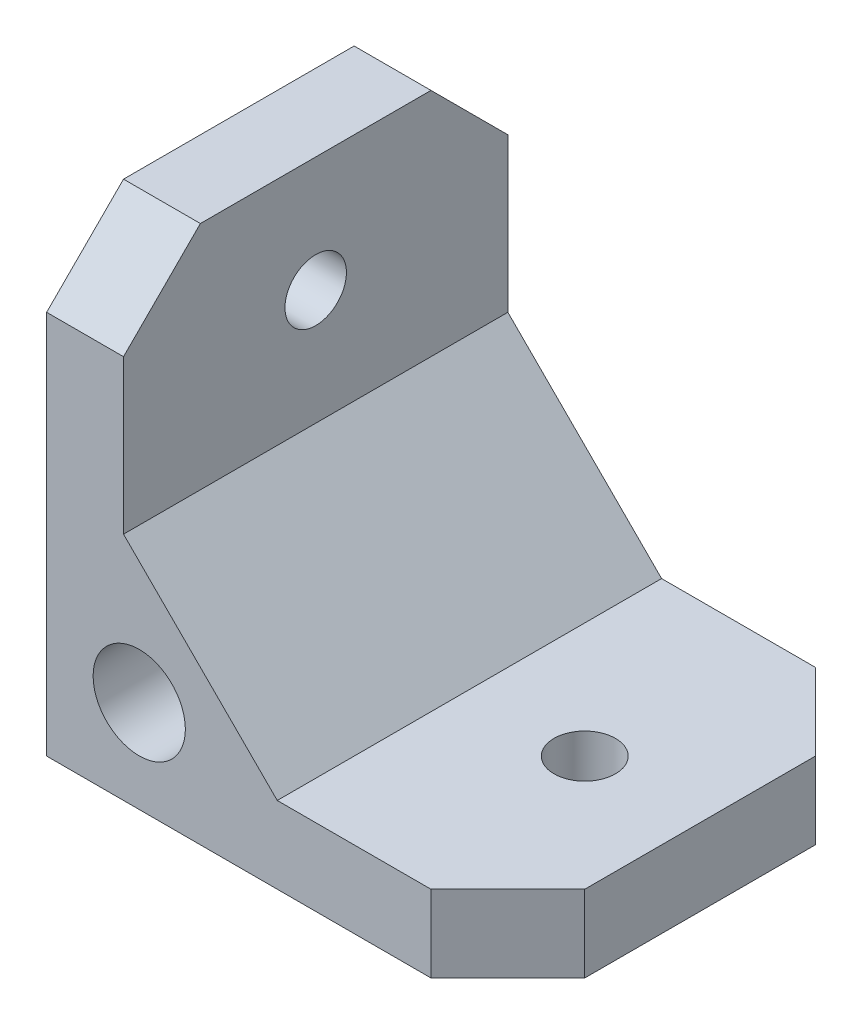
ISO-10303-21;
HEADER;
FILE_DESCRIPTION(('STEP AP214'),'2;1');
FILE_NAME('part.step','',(''),(''),'','','');
FILE_SCHEMA(('AUTOMOTIVE_DESIGN { 1 0 10303 214 1 1 1 1 }'));
ENDSEC;
DATA;
#1=APPLICATION_CONTEXT('core data for automotive mechanical design processes');
#2=APPLICATION_PROTOCOL_DEFINITION('international standard','automotive_design',2000,#1);
#3=PRODUCT_CONTEXT('',#1,'mechanical');
#4=PRODUCT('Part','Part','',(#3));
#5=PRODUCT_RELATED_PRODUCT_CATEGORY('part','',(#4));
#6=PRODUCT_DEFINITION_FORMATION('','',#4);
#7=PRODUCT_DEFINITION_CONTEXT('part definition',#1,'design');
#8=PRODUCT_DEFINITION('design','',#6,#7);
#9=PRODUCT_DEFINITION_SHAPE('','',#8);
#10=(LENGTH_UNIT() NAMED_UNIT(*) SI_UNIT(.MILLI.,.METRE.));
#11=(NAMED_UNIT(*) PLANE_ANGLE_UNIT() SI_UNIT($,.RADIAN.));
#12=(NAMED_UNIT(*) SI_UNIT($,.STERADIAN.) SOLID_ANGLE_UNIT());
#13=UNCERTAINTY_MEASURE_WITH_UNIT(LENGTH_MEASURE(1.E-05),#10,'distance_accuracy_value','');
#14=(GEOMETRIC_REPRESENTATION_CONTEXT(3) GLOBAL_UNCERTAINTY_ASSIGNED_CONTEXT((#13)) GLOBAL_UNIT_ASSIGNED_CONTEXT((#10,
#11,#12)) REPRESENTATION_CONTEXT('',''));
#15=CARTESIAN_POINT('',(0.,0.,0.));
#16=DIRECTION('',(0.,0.,1.));
#17=DIRECTION('',(1.,0.,0.));
#18=AXIS2_PLACEMENT_3D('',#15,#16,#17);
#19=CARTESIAN_POINT('',(0.,4.,0.));
#20=DIRECTION('',(0.,-1.,0.));
#21=DIRECTION('',(0.,0.,-1.));
#22=AXIS2_PLACEMENT_3D('',#19,#20,#21);
#23=PLANE('',#22);
#24=CARTESIAN_POINT('',(18.,4.,-10.));
#25=DIRECTION('',(0.,1.,0.));
#26=DIRECTION('',(0.,0.,1.));
#27=AXIS2_PLACEMENT_3D('',#24,#25,#26);
#28=CIRCLE('',#27,1.6);
#29=CARTESIAN_POINT('',(18.,4.,-8.4));
#30=VERTEX_POINT('',#29);
#31=EDGE_CURVE('E170',#30,#30,#28,.T.);
#32=ORIENTED_EDGE('',*,*,#31,.F.);
#33=EDGE_LOOP('',(#32));
#34=FACE_BOUND('',#33,.T.);
#35=DIRECTION('',(0.,0.,-1.));
#36=VECTOR('',#35,1.);
#37=CARTESIAN_POINT('',(24.,4.,0.));
#38=LINE('',#37,#36);
#39=CARTESIAN_POINT('',(24.,4.,-4.));
#40=VERTEX_POINT('',#39);
#41=CARTESIAN_POINT('',(24.,4.,-16.));
#42=VERTEX_POINT('',#41);
#43=EDGE_CURVE('E214',#40,#42,#38,.T.);
#44=ORIENTED_EDGE('',*,*,#43,.T.);
#45=DIRECTION('',(0.707106781186546,0.,0.707106781186549));
#46=VECTOR('',#45,1.);
#47=CARTESIAN_POINT('',(20.,4.,-20.));
#48=LINE('',#47,#46);
#49=CARTESIAN_POINT('',(20.,4.,-20.));
#50=VERTEX_POINT('',#49);
#51=EDGE_CURVE('E185',#42,#50,#48,.F.);
#52=ORIENTED_EDGE('',*,*,#51,.T.);
#53=DIRECTION('',(-1.,0.,0.));
#54=VECTOR('',#53,1.);
#55=CARTESIAN_POINT('',(0.,4.,-20.));
#56=LINE('',#55,#54);
#57=CARTESIAN_POINT('',(12.,4.,-20.));
#58=VERTEX_POINT('',#57);
#59=EDGE_CURVE('E146',#50,#58,#56,.T.);
#60=ORIENTED_EDGE('',*,*,#59,.T.);
#61=DIRECTION('',(0.,0.,1.));
#62=VECTOR('',#61,1.);
#63=CARTESIAN_POINT('',(12.,4.,0.));
#64=LINE('',#63,#62);
#65=CARTESIAN_POINT('',(12.,4.,0.));
#66=VERTEX_POINT('',#65);
#67=EDGE_CURVE('E157',#58,#66,#64,.T.);
#68=ORIENTED_EDGE('',*,*,#67,.T.);
#69=DIRECTION('',(1.,0.,0.));
#70=VECTOR('',#69,1.);
#71=CARTESIAN_POINT('',(0.,4.,0.));
#72=LINE('',#71,#70);
#73=CARTESIAN_POINT('',(20.,4.,0.));
#74=VERTEX_POINT('',#73);
#75=EDGE_CURVE('E153',#66,#74,#72,.T.);
#76=ORIENTED_EDGE('',*,*,#75,.T.);
#77=DIRECTION('',(-0.707106781186549,0.,0.707106781186546));
#78=VECTOR('',#77,1.);
#79=CARTESIAN_POINT('',(24.,4.,-4.));
#80=LINE('',#79,#78);
#81=EDGE_CURVE('E183',#74,#40,#80,.F.);
#82=ORIENTED_EDGE('',*,*,#81,.T.);
#83=EDGE_LOOP('',(#44,#52,#60,#68,#76,#82));
#84=FACE_BOUND('',#83,.T.);
#85=ADVANCED_FACE('F32',(#34,#84),#23,.F.);
#86=CARTESIAN_POINT('',(0.,4.,0.));
#87=DIRECTION('',(1.,0.,0.));
#88=DIRECTION('',(0.,0.,-1.));
#89=AXIS2_PLACEMENT_3D('',#86,#87,#88);
#90=PLANE('',#89);
#91=CARTESIAN_POINT('',(0.,18.,-10.));
#92=DIRECTION('',(1.,0.,0.));
#93=DIRECTION('',(0.,0.,-1.));
#94=AXIS2_PLACEMENT_3D('',#91,#92,#93);
#95=CIRCLE('',#94,1.6);
#96=CARTESIAN_POINT('',(0.,18.,-11.6));
#97=VERTEX_POINT('',#96);
#98=EDGE_CURVE('E300',#97,#97,#95,.T.);
#99=ORIENTED_EDGE('',*,*,#98,.T.);
#100=EDGE_LOOP('',(#99));
#101=FACE_BOUND('',#100,.T.);
#102=DIRECTION('',(0.,0.,1.));
#103=VECTOR('',#102,1.);
#104=CARTESIAN_POINT('',(0.,24.,-20.));
#105=LINE('',#104,#103);
#106=CARTESIAN_POINT('',(0.,24.,-16.));
#107=VERTEX_POINT('',#106);
#108=CARTESIAN_POINT('',(0.,24.,-4.));
#109=VERTEX_POINT('',#108);
#110=EDGE_CURVE('E169',#107,#109,#105,.T.);
#111=ORIENTED_EDGE('',*,*,#110,.F.);
#112=DIRECTION('',(0.,-0.707106781186549,-0.707106781186546));
#113=VECTOR('',#112,1.);
#114=CARTESIAN_POINT('',(0.,24.,-16.));
#115=LINE('',#114,#113);
#116=CARTESIAN_POINT('',(0.,20.,-20.));
#117=VERTEX_POINT('',#116);
#118=EDGE_CURVE('E197',#107,#117,#115,.T.);
#119=ORIENTED_EDGE('',*,*,#118,.T.);
#120=DIRECTION('',(0.,-1.,0.));
#121=VECTOR('',#120,1.);
#122=CARTESIAN_POINT('',(0.,4.,-20.));
#123=LINE('',#122,#121);
#124=CARTESIAN_POINT('',(0.,0.,-20.));
#125=VERTEX_POINT('',#124);
#126=EDGE_CURVE('E126',#117,#125,#123,.T.);
#127=ORIENTED_EDGE('',*,*,#126,.T.);
#128=DIRECTION('',(0.,0.,1.));
#129=VECTOR('',#128,1.);
#130=CARTESIAN_POINT('',(0.,0.,0.));
#131=LINE('',#130,#129);
#132=CARTESIAN_POINT('',(0.,0.,0.));
#133=VERTEX_POINT('',#132);
#134=EDGE_CURVE('E132',#125,#133,#131,.T.);
#135=ORIENTED_EDGE('',*,*,#134,.T.);
#136=DIRECTION('',(0.,-1.,0.));
#137=VECTOR('',#136,1.);
#138=CARTESIAN_POINT('',(0.,4.,0.));
#139=LINE('',#138,#137);
#140=CARTESIAN_POINT('',(0.,20.,0.));
#141=VERTEX_POINT('',#140);
#142=EDGE_CURVE('E115',#141,#133,#139,.T.);
#143=ORIENTED_EDGE('',*,*,#142,.F.);
#144=DIRECTION('',(0.,0.707106781186549,-0.707106781186546));
#145=VECTOR('',#144,1.);
#146=CARTESIAN_POINT('',(0.,24.,-4.));
#147=LINE('',#146,#145);
#148=EDGE_CURVE('E195',#141,#109,#147,.T.);
#149=ORIENTED_EDGE('',*,*,#148,.T.);
#150=EDGE_LOOP('',(#111,#119,#127,#135,#143,#149));
#151=FACE_BOUND('',#150,.T.);
#152=ADVANCED_FACE('F138',(#101,#151),#90,.F.);
#153=CARTESIAN_POINT('',(0.,4.,0.));
#154=DIRECTION('',(0.,0.,-1.));
#155=DIRECTION('',(-1.,0.,0.));
#156=AXIS2_PLACEMENT_3D('',#153,#154,#155);
#157=PLANE('',#156);
#158=CARTESIAN_POINT('',(4.81801948466053,4.81801948466056,0.));
#159=DIRECTION('',(0.,0.,-1.));
#160=DIRECTION('',(-1.,0.,0.));
#161=AXIS2_PLACEMENT_3D('',#158,#159,#160);
#162=CIRCLE('',#161,2.4);
#163=CARTESIAN_POINT('',(2.41801948466053,4.81801948466056,0.));
#164=VERTEX_POINT('',#163);
#165=EDGE_CURVE('E296',#164,#164,#162,.T.);
#166=ORIENTED_EDGE('',*,*,#165,.T.);
#167=EDGE_LOOP('',(#166));
#168=FACE_BOUND('',#167,.T.);
#169=DIRECTION('',(1.,0.,0.));
#170=VECTOR('',#169,1.);
#171=CARTESIAN_POINT('',(0.,0.,0.));
#172=LINE('',#171,#170);
#173=CARTESIAN_POINT('',(20.,0.,0.));
#174=VERTEX_POINT('',#173);
#175=EDGE_CURVE('E118',#133,#174,#172,.T.);
#176=ORIENTED_EDGE('',*,*,#175,.T.);
#177=DIRECTION('',(0.,1.,0.));
#178=VECTOR('',#177,1.);
#179=CARTESIAN_POINT('',(20.,4.,0.));
#180=LINE('',#179,#178);
#181=EDGE_CURVE('E188',#174,#74,#180,.T.);
#182=ORIENTED_EDGE('',*,*,#181,.T.);
#183=ORIENTED_EDGE('',*,*,#75,.F.);
#184=DIRECTION('',(0.707106781186544,-0.707106781186551,0.));
#185=VECTOR('',#184,1.);
#186=CARTESIAN_POINT('',(6.00000000000005,9.99999999999999,0.));
#187=LINE('',#186,#185);
#188=CARTESIAN_POINT('',(4.,12.0000000000001,0.));
#189=VERTEX_POINT('',#188);
#190=EDGE_CURVE('E162',#66,#189,#187,.F.);
#191=ORIENTED_EDGE('',*,*,#190,.T.);
#192=DIRECTION('',(0.,-1.,0.));
#193=VECTOR('',#192,1.);
#194=CARTESIAN_POINT('',(4.,24.,0.));
#195=LINE('',#194,#193);
#196=CARTESIAN_POINT('',(4.,20.,0.));
#197=VERTEX_POINT('',#196);
#198=EDGE_CURVE('E141',#197,#189,#195,.T.);
#199=ORIENTED_EDGE('',*,*,#198,.F.);
#200=DIRECTION('',(-1.,0.,0.));
#201=VECTOR('',#200,1.);
#202=CARTESIAN_POINT('',(0.,20.,0.));
#203=LINE('',#202,#201);
#204=EDGE_CURVE('E121',#197,#141,#203,.T.);
#205=ORIENTED_EDGE('',*,*,#204,.T.);
#206=ORIENTED_EDGE('',*,*,#142,.T.);
#207=EDGE_LOOP('',(#176,#182,#183,#191,#199,#205,#206));
#208=FACE_BOUND('',#207,.T.);
#209=ADVANCED_FACE('F117',(#168,#208),#157,.F.);
#210=CARTESIAN_POINT('',(24.,4.,0.));
#211=DIRECTION('',(-1.,0.,0.));
#212=DIRECTION('',(0.,0.,1.));
#213=AXIS2_PLACEMENT_3D('',#210,#211,#212);
#214=PLANE('',#213);
#215=DIRECTION('',(0.,0.,-1.));
#216=VECTOR('',#215,1.);
#217=CARTESIAN_POINT('',(24.,0.,0.));
#218=LINE('',#217,#216);
#219=CARTESIAN_POINT('',(24.,0.,-4.));
#220=VERTEX_POINT('',#219);
#221=CARTESIAN_POINT('',(24.,0.,-16.));
#222=VERTEX_POINT('',#221);
#223=EDGE_CURVE('E135',#220,#222,#218,.T.);
#224=ORIENTED_EDGE('',*,*,#223,.T.);
#225=DIRECTION('',(0.,1.,0.));
#226=VECTOR('',#225,1.);
#227=CARTESIAN_POINT('',(24.,4.,-16.));
#228=LINE('',#227,#226);
#229=EDGE_CURVE('E181',#222,#42,#228,.T.);
#230=ORIENTED_EDGE('',*,*,#229,.T.);
#231=ORIENTED_EDGE('',*,*,#43,.F.);
#232=DIRECTION('',(0.,-1.,0.));
#233=VECTOR('',#232,1.);
#234=CARTESIAN_POINT('',(24.,4.,-4.));
#235=LINE('',#234,#233);
#236=EDGE_CURVE('E178',#40,#220,#235,.T.);
#237=ORIENTED_EDGE('',*,*,#236,.T.);
#238=EDGE_LOOP('',(#224,#230,#231,#237));
#239=FACE_BOUND('',#238,.T.);
#240=ADVANCED_FACE('F233',(#239),#214,.F.);
#241=CARTESIAN_POINT('',(0.,4.,-20.));
#242=DIRECTION('',(0.,0.,1.));
#243=DIRECTION('',(1.,0.,0.));
#244=AXIS2_PLACEMENT_3D('',#241,#242,#243);
#245=PLANE('',#244);
#246=CARTESIAN_POINT('',(4.81801948466053,4.81801948466056,-20.));
#247=DIRECTION('',(0.,0.,1.));
#248=DIRECTION('',(1.,0.,0.));
#249=AXIS2_PLACEMENT_3D('',#246,#247,#248);
#250=CIRCLE('',#249,2.4);
#251=CARTESIAN_POINT('',(7.21801948466053,4.81801948466056,-20.));
#252=VERTEX_POINT('',#251);
#253=EDGE_CURVE('E293',#252,#252,#250,.T.);
#254=ORIENTED_EDGE('',*,*,#253,.T.);
#255=EDGE_LOOP('',(#254));
#256=FACE_BOUND('',#255,.T.);
#257=ORIENTED_EDGE('',*,*,#59,.F.);
#258=DIRECTION('',(0.,-1.,0.));
#259=VECTOR('',#258,1.);
#260=CARTESIAN_POINT('',(20.,4.,-20.));
#261=LINE('',#260,#259);
#262=CARTESIAN_POINT('',(20.,0.,-20.));
#263=VERTEX_POINT('',#262);
#264=EDGE_CURVE('E172',#50,#263,#261,.T.);
#265=ORIENTED_EDGE('',*,*,#264,.T.);
#266=DIRECTION('',(-1.,0.,0.));
#267=VECTOR('',#266,1.);
#268=CARTESIAN_POINT('',(0.,0.,-20.));
#269=LINE('',#268,#267);
#270=EDGE_CURVE('E151',#263,#125,#269,.T.);
#271=ORIENTED_EDGE('',*,*,#270,.T.);
#272=ORIENTED_EDGE('',*,*,#126,.F.);
#273=DIRECTION('',(1.,0.,0.));
#274=VECTOR('',#273,1.);
#275=CARTESIAN_POINT('',(4.,20.,-20.));
#276=LINE('',#275,#274);
#277=CARTESIAN_POINT('',(4.,20.,-20.));
#278=VERTEX_POINT('',#277);
#279=EDGE_CURVE('E165',#117,#278,#276,.T.);
#280=ORIENTED_EDGE('',*,*,#279,.T.);
#281=DIRECTION('',(0.,-1.,0.));
#282=VECTOR('',#281,1.);
#283=CARTESIAN_POINT('',(4.,24.,-20.));
#284=LINE('',#283,#282);
#285=CARTESIAN_POINT('',(4.,12.0000000000001,-20.));
#286=VERTEX_POINT('',#285);
#287=EDGE_CURVE('E143',#278,#286,#284,.T.);
#288=ORIENTED_EDGE('',*,*,#287,.T.);
#289=DIRECTION('',(-0.707106781186544,0.707106781186551,0.));
#290=VECTOR('',#289,1.);
#291=CARTESIAN_POINT('',(6.00000000000005,9.99999999999999,-20.));
#292=LINE('',#291,#290);
#293=EDGE_CURVE('E159',#286,#58,#292,.F.);
#294=ORIENTED_EDGE('',*,*,#293,.T.);
#295=EDGE_LOOP('',(#257,#265,#271,#272,#280,#288,#294));
#296=FACE_BOUND('',#295,.T.);
#297=ADVANCED_FACE('F224',(#256,#296),#245,.F.);
#298=CARTESIAN_POINT('',(0.,0.,0.));
#299=DIRECTION('',(0.,-1.,0.));
#300=DIRECTION('',(0.,0.,-1.));
#301=AXIS2_PLACEMENT_3D('',#298,#299,#300);
#302=PLANE('',#301);
#303=CARTESIAN_POINT('',(18.,0.,-10.));
#304=DIRECTION('',(0.,-1.,0.));
#305=DIRECTION('',(0.,0.,-1.));
#306=AXIS2_PLACEMENT_3D('',#303,#304,#305);
#307=CIRCLE('',#306,1.6);
#308=CARTESIAN_POINT('',(18.,0.,-11.6));
#309=VERTEX_POINT('',#308);
#310=EDGE_CURVE('E166',#309,#309,#307,.T.);
#311=ORIENTED_EDGE('',*,*,#310,.F.);
#312=EDGE_LOOP('',(#311));
#313=FACE_BOUND('',#312,.T.);
#314=ORIENTED_EDGE('',*,*,#270,.F.);
#315=DIRECTION('',(-0.707106781186546,0.,-0.707106781186549));
#316=VECTOR('',#315,1.);
#317=CARTESIAN_POINT('',(20.,0.,-20.));
#318=LINE('',#317,#316);
#319=EDGE_CURVE('E176',#263,#222,#318,.F.);
#320=ORIENTED_EDGE('',*,*,#319,.T.);
#321=ORIENTED_EDGE('',*,*,#223,.F.);
#322=DIRECTION('',(0.707106781186549,0.,-0.707106781186546));
#323=VECTOR('',#322,1.);
#324=CARTESIAN_POINT('',(9.99999999999996,0.,9.99999999999999));
#325=LINE('',#324,#323);
#326=EDGE_CURVE('E134',#220,#174,#325,.F.);
#327=ORIENTED_EDGE('',*,*,#326,.T.);
#328=ORIENTED_EDGE('',*,*,#175,.F.);
#329=ORIENTED_EDGE('',*,*,#134,.F.);
#330=EDGE_LOOP('',(#314,#320,#321,#327,#328,#329));
#331=FACE_BOUND('',#330,.T.);
#332=ADVANCED_FACE('F131',(#313,#331),#302,.T.);
#333=CARTESIAN_POINT('',(4.,24.,-20.));
#334=DIRECTION('',(-1.,0.,0.));
#335=DIRECTION('',(0.,0.,1.));
#336=AXIS2_PLACEMENT_3D('',#333,#334,#335);
#337=PLANE('',#336);
#338=CARTESIAN_POINT('',(4.,18.,-10.));
#339=DIRECTION('',(1.,0.,0.));
#340=DIRECTION('',(0.,0.,-1.));
#341=AXIS2_PLACEMENT_3D('',#338,#339,#340);
#342=CIRCLE('',#341,1.6);
#343=CARTESIAN_POINT('',(4.,18.,-11.6));
#344=VERTEX_POINT('',#343);
#345=EDGE_CURVE('E297',#344,#344,#342,.T.);
#346=ORIENTED_EDGE('',*,*,#345,.F.);
#347=EDGE_LOOP('',(#346));
#348=FACE_BOUND('',#347,.T.);
#349=ORIENTED_EDGE('',*,*,#287,.F.);
#350=DIRECTION('',(0.,0.707106781186549,0.707106781186546));
#351=VECTOR('',#350,1.);
#352=CARTESIAN_POINT('',(4.,24.,-16.));
#353=LINE('',#352,#351);
#354=CARTESIAN_POINT('',(4.,24.,-16.));
#355=VERTEX_POINT('',#354);
#356=EDGE_CURVE('E11',#278,#355,#353,.T.);
#357=ORIENTED_EDGE('',*,*,#356,.T.);
#358=DIRECTION('',(0.,0.,-1.));
#359=VECTOR('',#358,1.);
#360=CARTESIAN_POINT('',(4.,24.,-20.));
#361=LINE('',#360,#359);
#362=CARTESIAN_POINT('',(4.,24.,-4.));
#363=VERTEX_POINT('',#362);
#364=EDGE_CURVE('E199',#363,#355,#361,.T.);
#365=ORIENTED_EDGE('',*,*,#364,.F.);
#366=DIRECTION('',(0.,-0.707106781186549,0.707106781186546));
#367=VECTOR('',#366,1.);
#368=CARTESIAN_POINT('',(4.,24.,-4.));
#369=LINE('',#368,#367);
#370=EDGE_CURVE('E40',#363,#197,#369,.T.);
#371=ORIENTED_EDGE('',*,*,#370,.T.);
#372=ORIENTED_EDGE('',*,*,#198,.T.);
#373=DIRECTION('',(0.,0.,-1.));
#374=VECTOR('',#373,1.);
#375=CARTESIAN_POINT('',(4.,12.0000000000001,-20.));
#376=LINE('',#375,#374);
#377=EDGE_CURVE('E125',#189,#286,#376,.T.);
#378=ORIENTED_EDGE('',*,*,#377,.T.);
#379=EDGE_LOOP('',(#349,#357,#365,#371,#372,#378));
#380=FACE_BOUND('',#379,.T.);
#381=ADVANCED_FACE('F198',(#348,#380),#337,.F.);
#382=CARTESIAN_POINT('',(0.,24.,0.));
#383=DIRECTION('',(0.,1.,0.));
#384=DIRECTION('',(0.,0.,1.));
#385=AXIS2_PLACEMENT_3D('',#382,#383,#384);
#386=PLANE('',#385);
#387=ORIENTED_EDGE('',*,*,#364,.T.);
#388=DIRECTION('',(-1.,0.,0.));
#389=VECTOR('',#388,1.);
#390=CARTESIAN_POINT('',(0.,24.,-16.));
#391=LINE('',#390,#389);
#392=EDGE_CURVE('E192',#355,#107,#391,.T.);
#393=ORIENTED_EDGE('',*,*,#392,.T.);
#394=ORIENTED_EDGE('',*,*,#110,.T.);
#395=DIRECTION('',(1.,0.,0.));
#396=VECTOR('',#395,1.);
#397=CARTESIAN_POINT('',(4.,24.,-4.));
#398=LINE('',#397,#396);
#399=EDGE_CURVE('E190',#109,#363,#398,.T.);
#400=ORIENTED_EDGE('',*,*,#399,.T.);
#401=EDGE_LOOP('',(#387,#393,#394,#400));
#402=FACE_BOUND('',#401,.T.);
#403=ADVANCED_FACE('F205',(#402),#386,.T.);
#404=CARTESIAN_POINT('',(4.,12.0000000000001,-20.));
#405=DIRECTION('',(0.707106781186551,0.707106781186544,0.));
#406=DIRECTION('',(0.,0.,1.));
#407=AXIS2_PLACEMENT_3D('',#404,#405,#406);
#408=PLANE('',#407);
#409=ORIENTED_EDGE('',*,*,#190,.F.);
#410=ORIENTED_EDGE('',*,*,#67,.F.);
#411=ORIENTED_EDGE('',*,*,#293,.F.);
#412=ORIENTED_EDGE('',*,*,#377,.F.);
#413=EDGE_LOOP('',(#409,#410,#411,#412));
#414=FACE_BOUND('',#413,.T.);
#415=ADVANCED_FACE('F226',(#414),#408,.T.);
#416=CARTESIAN_POINT('',(18.,-16.,-10.));
#417=DIRECTION('',(0.,1.,0.));
#418=DIRECTION('',(0.,0.,1.));
#419=AXIS2_PLACEMENT_3D('',#416,#417,#418);
#420=CYLINDRICAL_SURFACE('',#419,1.6);
#421=ORIENTED_EDGE('',*,*,#310,.T.);
#422=EDGE_LOOP('',(#421));
#423=FACE_BOUND('',#422,.T.);
#424=ORIENTED_EDGE('',*,*,#31,.T.);
#425=EDGE_LOOP('',(#424));
#426=FACE_BOUND('',#425,.T.);
#427=ADVANCED_FACE('F246',(#423,#426),#420,.F.);
#428=CARTESIAN_POINT('',(-16.,18.,-9.99999999999999));
#429=DIRECTION('',(1.,0.,0.));
#430=DIRECTION('',(0.,0.,-1.));
#431=AXIS2_PLACEMENT_3D('',#428,#429,#430);
#432=CYLINDRICAL_SURFACE('',#431,1.6);
#433=ORIENTED_EDGE('',*,*,#345,.T.);
#434=EDGE_LOOP('',(#433));
#435=FACE_BOUND('',#434,.T.);
#436=ORIENTED_EDGE('',*,*,#98,.F.);
#437=EDGE_LOOP('',(#436));
#438=FACE_BOUND('',#437,.T.);
#439=ADVANCED_FACE('F238',(#435,#438),#432,.F.);
#440=CARTESIAN_POINT('',(20.,4.,-20.));
#441=DIRECTION('',(-0.707106781186549,0.,0.707106781186546));
#442=DIRECTION('',(0.,-1.,0.));
#443=AXIS2_PLACEMENT_3D('',#440,#441,#442);
#444=PLANE('',#443);
#445=ORIENTED_EDGE('',*,*,#51,.F.);
#446=ORIENTED_EDGE('',*,*,#229,.F.);
#447=ORIENTED_EDGE('',*,*,#319,.F.);
#448=ORIENTED_EDGE('',*,*,#264,.F.);
#449=EDGE_LOOP('',(#445,#446,#447,#448));
#450=FACE_BOUND('',#449,.T.);
#451=ADVANCED_FACE('F235',(#450),#444,.F.);
#452=CARTESIAN_POINT('',(24.,4.,-4.));
#453=DIRECTION('',(-0.707106781186546,0.,-0.707106781186549));
#454=DIRECTION('',(0.,-1.,0.));
#455=AXIS2_PLACEMENT_3D('',#452,#453,#454);
#456=PLANE('',#455);
#457=ORIENTED_EDGE('',*,*,#81,.F.);
#458=ORIENTED_EDGE('',*,*,#181,.F.);
#459=ORIENTED_EDGE('',*,*,#326,.F.);
#460=ORIENTED_EDGE('',*,*,#236,.F.);
#461=EDGE_LOOP('',(#457,#458,#459,#460));
#462=FACE_BOUND('',#461,.T.);
#463=ADVANCED_FACE('F237',(#462),#456,.F.);
#464=CARTESIAN_POINT('',(0.,24.,-16.));
#465=DIRECTION('',(0.,0.707106781186546,-0.707106781186549));
#466=DIRECTION('',(1.,0.,0.));
#467=AXIS2_PLACEMENT_3D('',#464,#465,#466);
#468=PLANE('',#467);
#469=ORIENTED_EDGE('',*,*,#356,.F.);
#470=ORIENTED_EDGE('',*,*,#279,.F.);
#471=ORIENTED_EDGE('',*,*,#118,.F.);
#472=ORIENTED_EDGE('',*,*,#392,.F.);
#473=EDGE_LOOP('',(#469,#470,#471,#472));
#474=FACE_BOUND('',#473,.T.);
#475=ADVANCED_FACE('F229',(#474),#468,.T.);
#476=CARTESIAN_POINT('',(0.,24.,-4.));
#477=DIRECTION('',(0.,0.707106781186546,0.707106781186549));
#478=DIRECTION('',(-1.,0.,0.));
#479=AXIS2_PLACEMENT_3D('',#476,#477,#478);
#480=PLANE('',#479);
#481=ORIENTED_EDGE('',*,*,#148,.F.);
#482=ORIENTED_EDGE('',*,*,#204,.F.);
#483=ORIENTED_EDGE('',*,*,#370,.F.);
#484=ORIENTED_EDGE('',*,*,#399,.F.);
#485=EDGE_LOOP('',(#481,#482,#483,#484));
#486=FACE_BOUND('',#485,.T.);
#487=ADVANCED_FACE('F34',(#486),#480,.T.);
#488=CARTESIAN_POINT('',(4.81801948466053,4.81801948466056,-20.));
#489=DIRECTION('',(0.,0.,1.));
#490=DIRECTION('',(1.,0.,0.));
#491=AXIS2_PLACEMENT_3D('',#488,#489,#490);
#492=CYLINDRICAL_SURFACE('',#491,2.4);
#493=ORIENTED_EDGE('',*,*,#253,.F.);
#494=EDGE_LOOP('',(#493));
#495=FACE_BOUND('',#494,.T.);
#496=ORIENTED_EDGE('',*,*,#165,.F.);
#497=EDGE_LOOP('',(#496));
#498=FACE_BOUND('',#497,.T.);
#499=ADVANCED_FACE('F284',(#495,#498),#492,.F.);
#500=CLOSED_SHELL('',(#85,#152,#209,#240,#297,#332,#381,#403,#415,#427,#439,#451,#463,#475,#487,#499));
#501=MANIFOLD_SOLID_BREP('B2',#500);
#502=ADVANCED_BREP_SHAPE_REPRESENTATION('',(#18,#501),#14);
#503=SHAPE_DEFINITION_REPRESENTATION(#9,#502);
ENDSEC;
END-ISO-10303-21;
